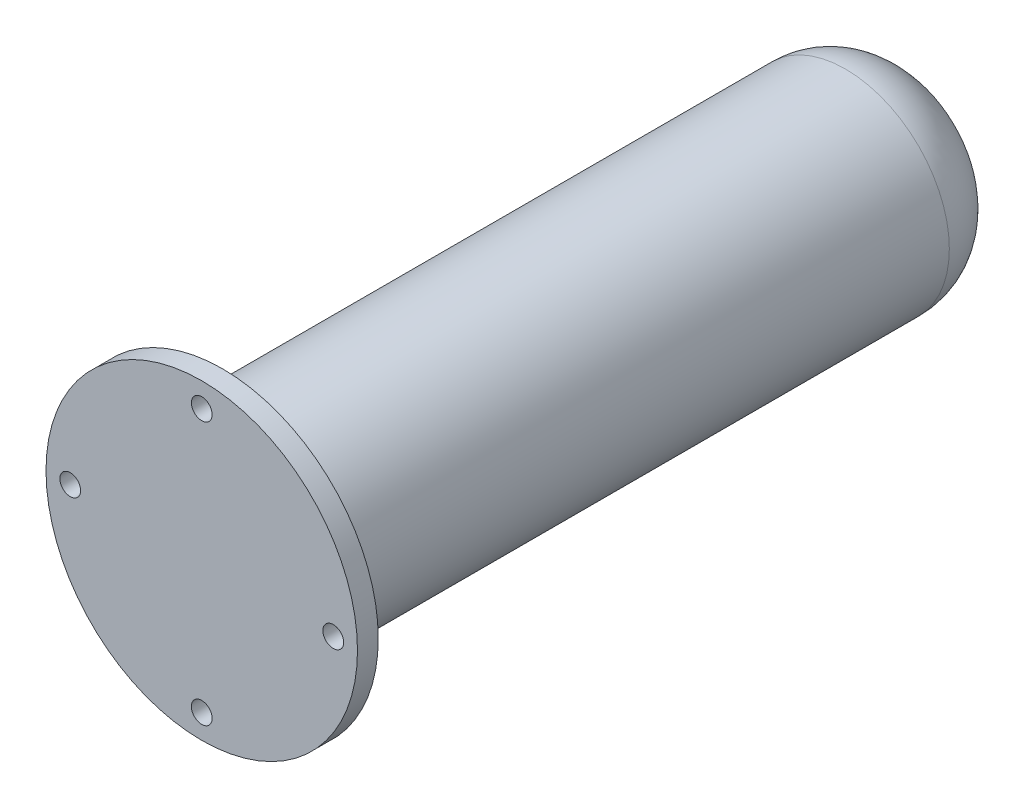
ISO-10303-21;
HEADER;
FILE_DESCRIPTION(('STEP AP214'),'2;1');
FILE_NAME('part.step','',(''),(''),'','','');
FILE_SCHEMA(('AUTOMOTIVE_DESIGN { 1 0 10303 214 1 1 1 1 }'));
ENDSEC;
DATA;
#1=APPLICATION_CONTEXT('core data for automotive mechanical design processes');
#2=APPLICATION_PROTOCOL_DEFINITION('international standard','automotive_design',2000,#1);
#3=PRODUCT_CONTEXT('',#1,'mechanical');
#4=PRODUCT('Part','Part','',(#3));
#5=PRODUCT_RELATED_PRODUCT_CATEGORY('part','',(#4));
#6=PRODUCT_DEFINITION_FORMATION('','',#4);
#7=PRODUCT_DEFINITION_CONTEXT('part definition',#1,'design');
#8=PRODUCT_DEFINITION('design','',#6,#7);
#9=PRODUCT_DEFINITION_SHAPE('','',#8);
#10=(LENGTH_UNIT() NAMED_UNIT(*) SI_UNIT(.MILLI.,.METRE.));
#11=(NAMED_UNIT(*) PLANE_ANGLE_UNIT() SI_UNIT($,.RADIAN.));
#12=(NAMED_UNIT(*) SI_UNIT($,.STERADIAN.) SOLID_ANGLE_UNIT());
#13=UNCERTAINTY_MEASURE_WITH_UNIT(LENGTH_MEASURE(1.E-05),#10,'distance_accuracy_value','');
#14=(GEOMETRIC_REPRESENTATION_CONTEXT(3) GLOBAL_UNCERTAINTY_ASSIGNED_CONTEXT((#13)) GLOBAL_UNIT_ASSIGNED_CONTEXT((#10,
#11,#12)) REPRESENTATION_CONTEXT('',''));
#15=CARTESIAN_POINT('',(0.,0.,0.));
#16=DIRECTION('',(0.,0.,1.));
#17=DIRECTION('',(1.,0.,0.));
#18=AXIS2_PLACEMENT_3D('',#15,#16,#17);
#19=CARTESIAN_POINT('',(0.,0.,3.));
#20=DIRECTION('',(0.,0.,1.));
#21=DIRECTION('',(1.,0.,0.));
#22=AXIS2_PLACEMENT_3D('',#19,#20,#21);
#23=PLANE('',#22);
#24=CARTESIAN_POINT('',(1.07304447160021E-12,-19.,3.));
#25=DIRECTION('',(0.,0.,1.));
#26=DIRECTION('',(1.,0.,0.));
#27=AXIS2_PLACEMENT_3D('',#24,#25,#26);
#28=CIRCLE('',#27,1.5);
#29=CARTESIAN_POINT('',(1.50000000000107,-19.,3.));
#30=VERTEX_POINT('',#29);
#31=EDGE_CURVE('E64',#30,#30,#28,.T.);
#32=ORIENTED_EDGE('',*,*,#31,.F.);
#33=EDGE_LOOP('',(#32));
#34=FACE_BOUND('',#33,.T.);
#35=CARTESIAN_POINT('',(0.,19.,3.));
#36=DIRECTION('',(0.,0.,1.));
#37=DIRECTION('',(1.,0.,0.));
#38=AXIS2_PLACEMENT_3D('',#35,#36,#37);
#39=CIRCLE('',#38,1.5);
#40=CARTESIAN_POINT('',(1.5,19.,3.));
#41=VERTEX_POINT('',#40);
#42=EDGE_CURVE('E52',#41,#41,#39,.T.);
#43=ORIENTED_EDGE('',*,*,#42,.F.);
#44=EDGE_LOOP('',(#43));
#45=FACE_BOUND('',#44,.T.);
#46=CARTESIAN_POINT('',(0.,0.,3.));
#47=DIRECTION('',(0.,0.,1.));
#48=DIRECTION('',(1.,0.,0.));
#49=AXIS2_PLACEMENT_3D('',#46,#47,#48);
#50=CIRCLE('',#49,22.5);
#51=CARTESIAN_POINT('',(22.5,0.,3.));
#52=VERTEX_POINT('',#51);
#53=EDGE_CURVE('E46',#52,#52,#50,.T.);
#54=ORIENTED_EDGE('',*,*,#53,.T.);
#55=EDGE_LOOP('',(#54));
#56=FACE_BOUND('',#55,.T.);
#57=CARTESIAN_POINT('',(19.0000000000005,5.36522235800106E-13,3.));
#58=DIRECTION('',(0.,0.,1.));
#59=DIRECTION('',(1.,0.,0.));
#60=AXIS2_PLACEMENT_3D('',#57,#58,#59);
#61=CIRCLE('',#60,1.5);
#62=CARTESIAN_POINT('',(20.5000000000005,5.36522235800106E-13,3.));
#63=VERTEX_POINT('',#62);
#64=EDGE_CURVE('E58',#63,#63,#61,.T.);
#65=ORIENTED_EDGE('',*,*,#64,.F.);
#66=EDGE_LOOP('',(#65));
#67=FACE_BOUND('',#66,.T.);
#68=CARTESIAN_POINT('',(-18.9999999999995,-5.38849064718486E-13,3.));
#69=DIRECTION('',(0.,0.,1.));
#70=DIRECTION('',(1.,0.,0.));
#71=AXIS2_PLACEMENT_3D('',#68,#69,#70);
#72=CIRCLE('',#71,1.5);
#73=CARTESIAN_POINT('',(-17.4999999999995,-5.38849064718486E-13,3.));
#74=VERTEX_POINT('',#73);
#75=EDGE_CURVE('E70',#74,#74,#72,.T.);
#76=ORIENTED_EDGE('',*,*,#75,.F.);
#77=EDGE_LOOP('',(#76));
#78=FACE_BOUND('',#77,.T.);
#79=ADVANCED_FACE('F31',(#34,#45,#56,#67,#78),#23,.T.);
#80=CARTESIAN_POINT('',(0.,0.,0.));
#81=DIRECTION('',(0.,0.,1.));
#82=DIRECTION('',(1.,0.,0.));
#83=AXIS2_PLACEMENT_3D('',#80,#81,#82);
#84=PLANE('',#83);
#85=CARTESIAN_POINT('',(0.,0.,0.));
#86=DIRECTION('',(0.,0.,-1.));
#87=DIRECTION('',(-1.,0.,0.));
#88=AXIS2_PLACEMENT_3D('',#85,#86,#87);
#89=CIRCLE('',#88,15.);
#90=CARTESIAN_POINT('',(-15.,0.,0.));
#91=VERTEX_POINT('',#90);
#92=EDGE_CURVE('E42',#91,#91,#89,.T.);
#93=ORIENTED_EDGE('',*,*,#92,.F.);
#94=EDGE_LOOP('',(#93));
#95=FACE_BOUND('',#94,.T.);
#96=CARTESIAN_POINT('',(0.,0.,0.));
#97=DIRECTION('',(0.,0.,1.));
#98=DIRECTION('',(1.,0.,0.));
#99=AXIS2_PLACEMENT_3D('',#96,#97,#98);
#100=CIRCLE('',#99,22.5);
#101=CARTESIAN_POINT('',(22.5,0.,0.));
#102=VERTEX_POINT('',#101);
#103=EDGE_CURVE('E49',#102,#102,#100,.T.);
#104=ORIENTED_EDGE('',*,*,#103,.F.);
#105=EDGE_LOOP('',(#104));
#106=FACE_BOUND('',#105,.T.);
#107=CARTESIAN_POINT('',(0.,19.,0.));
#108=DIRECTION('',(0.,0.,1.));
#109=DIRECTION('',(1.,0.,0.));
#110=AXIS2_PLACEMENT_3D('',#107,#108,#109);
#111=CIRCLE('',#110,1.5);
#112=CARTESIAN_POINT('',(1.5,19.,0.));
#113=VERTEX_POINT('',#112);
#114=EDGE_CURVE('E55',#113,#113,#111,.T.);
#115=ORIENTED_EDGE('',*,*,#114,.T.);
#116=EDGE_LOOP('',(#115));
#117=FACE_BOUND('',#116,.T.);
#118=CARTESIAN_POINT('',(19.0000000000005,5.36522235800106E-13,0.));
#119=DIRECTION('',(0.,0.,1.));
#120=DIRECTION('',(1.,0.,0.));
#121=AXIS2_PLACEMENT_3D('',#118,#119,#120);
#122=CIRCLE('',#121,1.5);
#123=CARTESIAN_POINT('',(20.5000000000005,5.36522235800106E-13,0.));
#124=VERTEX_POINT('',#123);
#125=EDGE_CURVE('E61',#124,#124,#122,.T.);
#126=ORIENTED_EDGE('',*,*,#125,.T.);
#127=EDGE_LOOP('',(#126));
#128=FACE_BOUND('',#127,.T.);
#129=CARTESIAN_POINT('',(1.07304447160021E-12,-19.,0.));
#130=DIRECTION('',(0.,0.,1.));
#131=DIRECTION('',(1.,0.,0.));
#132=AXIS2_PLACEMENT_3D('',#129,#130,#131);
#133=CIRCLE('',#132,1.5);
#134=CARTESIAN_POINT('',(1.50000000000107,-19.,0.));
#135=VERTEX_POINT('',#134);
#136=EDGE_CURVE('E67',#135,#135,#133,.T.);
#137=ORIENTED_EDGE('',*,*,#136,.T.);
#138=EDGE_LOOP('',(#137));
#139=FACE_BOUND('',#138,.T.);
#140=CARTESIAN_POINT('',(-18.9999999999995,-5.38849064718486E-13,0.));
#141=DIRECTION('',(0.,0.,1.));
#142=DIRECTION('',(1.,0.,0.));
#143=AXIS2_PLACEMENT_3D('',#140,#141,#142);
#144=CIRCLE('',#143,1.5);
#145=CARTESIAN_POINT('',(-17.4999999999995,-5.38849064718486E-13,0.));
#146=VERTEX_POINT('',#145);
#147=EDGE_CURVE('E73',#146,#146,#144,.T.);
#148=ORIENTED_EDGE('',*,*,#147,.T.);
#149=EDGE_LOOP('',(#148));
#150=FACE_BOUND('',#149,.T.);
#151=ADVANCED_FACE('F83',(#95,#106,#117,#128,#139,#150),#84,.F.);
#152=CARTESIAN_POINT('',(0.,0.,3.));
#153=DIRECTION('',(0.,0.,-1.));
#154=DIRECTION('',(-1.,0.,0.));
#155=AXIS2_PLACEMENT_3D('',#152,#153,#154);
#156=CYLINDRICAL_SURFACE('',#155,22.5);
#157=ORIENTED_EDGE('',*,*,#53,.F.);
#158=EDGE_LOOP('',(#157));
#159=FACE_BOUND('',#158,.T.);
#160=ORIENTED_EDGE('',*,*,#103,.T.);
#161=EDGE_LOOP('',(#160));
#162=FACE_BOUND('',#161,.T.);
#163=ADVANCED_FACE('F89',(#159,#162),#156,.T.);
#164=CARTESIAN_POINT('',(0.,19.,3.));
#165=DIRECTION('',(0.,0.,-1.));
#166=DIRECTION('',(-1.,0.,0.));
#167=AXIS2_PLACEMENT_3D('',#164,#165,#166);
#168=CYLINDRICAL_SURFACE('',#167,1.5);
#169=ORIENTED_EDGE('',*,*,#42,.T.);
#170=EDGE_LOOP('',(#169));
#171=FACE_BOUND('',#170,.T.);
#172=ORIENTED_EDGE('',*,*,#114,.F.);
#173=EDGE_LOOP('',(#172));
#174=FACE_BOUND('',#173,.T.);
#175=ADVANCED_FACE('F95',(#171,#174),#168,.F.);
#176=CARTESIAN_POINT('',(19.0000000000005,5.36522235800106E-13,3.));
#177=DIRECTION('',(0.,0.,-1.));
#178=DIRECTION('',(-1.,0.,0.));
#179=AXIS2_PLACEMENT_3D('',#176,#177,#178);
#180=CYLINDRICAL_SURFACE('',#179,1.5);
#181=ORIENTED_EDGE('',*,*,#64,.T.);
#182=EDGE_LOOP('',(#181));
#183=FACE_BOUND('',#182,.T.);
#184=ORIENTED_EDGE('',*,*,#125,.F.);
#185=EDGE_LOOP('',(#184));
#186=FACE_BOUND('',#185,.T.);
#187=ADVANCED_FACE('F102',(#183,#186),#180,.F.);
#188=CARTESIAN_POINT('',(1.07304447160021E-12,-19.,3.));
#189=DIRECTION('',(0.,0.,-1.));
#190=DIRECTION('',(-1.,0.,0.));
#191=AXIS2_PLACEMENT_3D('',#188,#189,#190);
#192=CYLINDRICAL_SURFACE('',#191,1.5);
#193=ORIENTED_EDGE('',*,*,#31,.T.);
#194=EDGE_LOOP('',(#193));
#195=FACE_BOUND('',#194,.T.);
#196=ORIENTED_EDGE('',*,*,#136,.F.);
#197=EDGE_LOOP('',(#196));
#198=FACE_BOUND('',#197,.T.);
#199=ADVANCED_FACE('F118',(#195,#198),#192,.F.);
#200=CARTESIAN_POINT('',(-18.9999999999995,-5.38849064718486E-13,3.));
#201=DIRECTION('',(0.,0.,-1.));
#202=DIRECTION('',(-1.,0.,0.));
#203=AXIS2_PLACEMENT_3D('',#200,#201,#202);
#204=CYLINDRICAL_SURFACE('',#203,1.5);
#205=ORIENTED_EDGE('',*,*,#75,.T.);
#206=EDGE_LOOP('',(#205));
#207=FACE_BOUND('',#206,.T.);
#208=ORIENTED_EDGE('',*,*,#147,.F.);
#209=EDGE_LOOP('',(#208));
#210=FACE_BOUND('',#209,.T.);
#211=ADVANCED_FACE('F79',(#207,#210),#204,.F.);
#212=CARTESIAN_POINT('',(0.,0.,-100.));
#213=DIRECTION('',(0.,0.,1.));
#214=DIRECTION('',(1.,0.,0.));
#215=AXIS2_PLACEMENT_3D('',#212,#213,#214);
#216=CYLINDRICAL_SURFACE('',#215,15.);
#217=CARTESIAN_POINT('',(0.,0.,-90.));
#218=DIRECTION('',(0.,0.,-1.));
#219=DIRECTION('',(-1.,0.,0.));
#220=AXIS2_PLACEMENT_3D('',#217,#218,#219);
#221=CIRCLE('',#220,15.);
#222=CARTESIAN_POINT('',(-15.,0.,-90.));
#223=VERTEX_POINT('',#222);
#224=EDGE_CURVE('E10',#223,#223,#221,.F.);
#225=ORIENTED_EDGE('',*,*,#224,.T.);
#226=EDGE_LOOP('',(#225));
#227=FACE_BOUND('',#226,.T.);
#228=ORIENTED_EDGE('',*,*,#92,.T.);
#229=EDGE_LOOP('',(#228));
#230=FACE_BOUND('',#229,.T.);
#231=ADVANCED_FACE('F117',(#227,#230),#216,.T.);
#232=CARTESIAN_POINT('',(0.,0.,-100.));
#233=DIRECTION('',(0.,0.,-1.));
#234=DIRECTION('',(-1.,0.,0.));
#235=AXIS2_PLACEMENT_3D('',#232,#233,#234);
#236=PLANE('',#235);
#237=CARTESIAN_POINT('',(0.,0.,-100.));
#238=DIRECTION('',(0.,0.,-1.));
#239=DIRECTION('',(-1.,0.,0.));
#240=AXIS2_PLACEMENT_3D('',#237,#238,#239);
#241=CIRCLE('',#240,5.);
#242=CARTESIAN_POINT('',(-5.,0.,-100.));
#243=VERTEX_POINT('',#242);
#244=EDGE_CURVE('E38',#243,#243,#241,.T.);
#245=ORIENTED_EDGE('',*,*,#244,.T.);
#246=EDGE_LOOP('',(#245));
#247=FACE_BOUND('',#246,.T.);
#248=ADVANCED_FACE('F124',(#247),#236,.T.);
#249=CARTESIAN_POINT('',(0.,0.,-90.));
#250=DIRECTION('',(0.,0.,-1.));
#251=DIRECTION('',(-1.,0.,0.));
#252=AXIS2_PLACEMENT_3D('',#249,#250,#251);
#253=DEGENERATE_TOROIDAL_SURFACE('',#252,5.,10.,.T.);
#254=ORIENTED_EDGE('',*,*,#224,.F.);
#255=EDGE_LOOP('',(#254));
#256=FACE_BOUND('',#255,.T.);
#257=ORIENTED_EDGE('',*,*,#244,.F.);
#258=EDGE_LOOP('',(#257));
#259=FACE_BOUND('',#258,.T.);
#260=ADVANCED_FACE('F33',(#256,#259),#253,.T.);
#261=CLOSED_SHELL('',(#79,#151,#163,#175,#187,#199,#211,#231,#248,#260));
#262=MANIFOLD_SOLID_BREP('B2',#261);
#263=ADVANCED_BREP_SHAPE_REPRESENTATION('',(#18,#262),#14);
#264=SHAPE_DEFINITION_REPRESENTATION(#9,#263);
ENDSEC;
END-ISO-10303-21;
